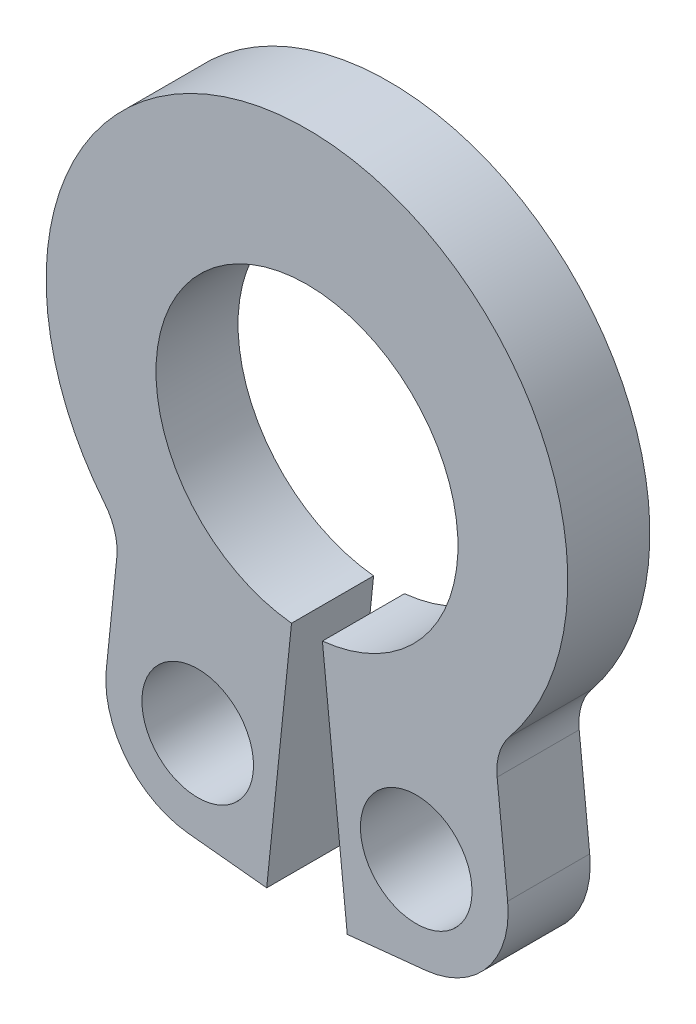
ISO-10303-21;
HEADER;
FILE_DESCRIPTION(('STEP AP214'),'2;1');
FILE_NAME('part.step','',(''),(''),'','','');
FILE_SCHEMA(('AUTOMOTIVE_DESIGN { 1 0 10303 214 1 1 1 1 }'));
ENDSEC;
DATA;
#1=APPLICATION_CONTEXT('core data for automotive mechanical design processes');
#2=APPLICATION_PROTOCOL_DEFINITION('international standard','automotive_design',2000,#1);
#3=PRODUCT_CONTEXT('',#1,'mechanical');
#4=PRODUCT('Part','Part','',(#3));
#5=PRODUCT_RELATED_PRODUCT_CATEGORY('part','',(#4));
#6=PRODUCT_DEFINITION_FORMATION('','',#4);
#7=PRODUCT_DEFINITION_CONTEXT('part definition',#1,'design');
#8=PRODUCT_DEFINITION('design','',#6,#7);
#9=PRODUCT_DEFINITION_SHAPE('','',#8);
#10=(LENGTH_UNIT() NAMED_UNIT(*) SI_UNIT(.MILLI.,.METRE.));
#11=(NAMED_UNIT(*) PLANE_ANGLE_UNIT() SI_UNIT($,.RADIAN.));
#12=(NAMED_UNIT(*) SI_UNIT($,.STERADIAN.) SOLID_ANGLE_UNIT());
#13=UNCERTAINTY_MEASURE_WITH_UNIT(LENGTH_MEASURE(1.E-05),#10,'distance_accuracy_value','');
#14=(GEOMETRIC_REPRESENTATION_CONTEXT(3) GLOBAL_UNCERTAINTY_ASSIGNED_CONTEXT((#13)) GLOBAL_UNIT_ASSIGNED_CONTEXT((#10,
#11,#12)) REPRESENTATION_CONTEXT('',''));
#15=CARTESIAN_POINT('',(0.,0.,0.));
#16=DIRECTION('',(0.,0.,1.));
#17=DIRECTION('',(1.,0.,0.));
#18=AXIS2_PLACEMENT_3D('',#15,#16,#17);
#19=CARTESIAN_POINT('',(0.,0.,-0.635));
#20=DIRECTION('',(0.,0.,1.));
#21=DIRECTION('',(1.,0.,0.));
#22=AXIS2_PLACEMENT_3D('',#19,#20,#21);
#23=CYLINDRICAL_SURFACE('',#22,1.1684);
#24=CARTESIAN_POINT('',(0.,0.,0.));
#25=DIRECTION('',(0.,0.,-1.));
#26=DIRECTION('',(1.,0.,0.));
#27=AXIS2_PLACEMENT_3D('',#24,#25,#26);
#28=CIRCLE('',#27,1.1684);
#29=CARTESIAN_POINT('',(-0.119485431623874,-1.1622744046178,0.));
#30=VERTEX_POINT('',#29);
#31=CARTESIAN_POINT('',(0.119485431623874,-1.1622744046178,0.));
#32=VERTEX_POINT('',#31);
#33=EDGE_CURVE('E153',#30,#32,#28,.T.);
#34=ORIENTED_EDGE('',*,*,#33,.F.);
#35=DIRECTION('',(0.,0.,1.));
#36=VECTOR('',#35,1.);
#37=CARTESIAN_POINT('',(-0.119485431623874,-1.1622744046178,-0.635));
#38=LINE('',#37,#36);
#39=CARTESIAN_POINT('',(-0.119485431623874,-1.1622744046178,-0.635));
#40=VERTEX_POINT('',#39);
#41=EDGE_CURVE('E11',#40,#30,#38,.T.);
#42=ORIENTED_EDGE('',*,*,#41,.F.);
#43=CARTESIAN_POINT('',(0.,0.,-0.635));
#44=DIRECTION('',(0.,0.,-1.));
#45=DIRECTION('',(1.,0.,0.));
#46=AXIS2_PLACEMENT_3D('',#43,#44,#45);
#47=CIRCLE('',#46,1.1684);
#48=CARTESIAN_POINT('',(0.119485431623874,-1.1622744046178,-0.635));
#49=VERTEX_POINT('',#48);
#50=EDGE_CURVE('E186',#40,#49,#47,.T.);
#51=ORIENTED_EDGE('',*,*,#50,.T.);
#52=DIRECTION('',(0.,0.,1.));
#53=VECTOR('',#52,1.);
#54=CARTESIAN_POINT('',(0.119485431623874,-1.1622744046178,-0.635));
#55=LINE('',#54,#53);
#56=EDGE_CURVE('E35',#49,#32,#55,.T.);
#57=ORIENTED_EDGE('',*,*,#56,.T.);
#58=EDGE_LOOP('',(#34,#42,#51,#57));
#59=FACE_BOUND('',#58,.T.);
#60=ADVANCED_FACE('F32',(#59),#23,.F.);
#61=CARTESIAN_POINT('',(-0.119485431623874,-1.1622744046178,-0.635));
#62=DIRECTION('',(0.994757278858095,-0.102264148942035,0.));
#63=DIRECTION('',(0.102264148942035,0.994757278858095,0.));
#64=AXIS2_PLACEMENT_3D('',#61,#62,#63);
#65=PLANE('',#64);
#66=DIRECTION('',(0.102264148942034,0.994757278858095,0.));
#67=VECTOR('',#66,1.);
#68=CARTESIAN_POINT('',(-0.119485431623874,-1.1622744046178,0.));
#69=LINE('',#68,#67);
#70=CARTESIAN_POINT('',(-0.311701125975322,-3.03202018595947,0.));
#71=VERTEX_POINT('',#70);
#72=EDGE_CURVE('E184',#71,#30,#69,.T.);
#73=ORIENTED_EDGE('',*,*,#72,.F.);
#74=DIRECTION('',(0.,0.,1.));
#75=VECTOR('',#74,1.);
#76=CARTESIAN_POINT('',(-0.311701125975322,-3.03202018595947,-0.635));
#77=LINE('',#76,#75);
#78=CARTESIAN_POINT('',(-0.311701125975322,-3.03202018595947,-0.635));
#79=VERTEX_POINT('',#78);
#80=EDGE_CURVE('E41',#79,#71,#77,.T.);
#81=ORIENTED_EDGE('',*,*,#80,.F.);
#82=DIRECTION('',(0.102264148942034,0.994757278858095,0.));
#83=VECTOR('',#82,1.);
#84=CARTESIAN_POINT('',(-0.119485431623874,-1.1622744046178,-0.635));
#85=LINE('',#84,#83);
#86=EDGE_CURVE('E143',#79,#40,#85,.T.);
#87=ORIENTED_EDGE('',*,*,#86,.T.);
#88=ORIENTED_EDGE('',*,*,#41,.T.);
#89=EDGE_LOOP('',(#73,#81,#87,#88));
#90=FACE_BOUND('',#89,.T.);
#91=ADVANCED_FACE('F206',(#90),#65,.T.);
#92=CARTESIAN_POINT('',(-0.311701125975322,-3.03202018595947,-0.635));
#93=DIRECTION('',(-0.102264148942033,-0.994757278858095,0.));
#94=DIRECTION('',(0.994757278858095,-0.102264148942033,0.));
#95=AXIS2_PLACEMENT_3D('',#92,#93,#94);
#96=PLANE('',#95);
#97=DIRECTION('',(0.994757278858095,-0.102264148942033,0.));
#98=VECTOR('',#97,1.);
#99=CARTESIAN_POINT('',(-0.311701125975322,-3.03202018595947,0.));
#100=LINE('',#99,#98);
#101=CARTESIAN_POINT('',(-0.918105163167215,-2.96967996076441,0.));
#102=VERTEX_POINT('',#101);
#103=EDGE_CURVE('E130',#102,#71,#100,.T.);
#104=ORIENTED_EDGE('',*,*,#103,.F.);
#105=DIRECTION('',(0.,0.,1.));
#106=VECTOR('',#105,1.);
#107=CARTESIAN_POINT('',(-0.918105163167215,-2.96967996076441,-0.635));
#108=LINE('',#107,#106);
#109=CARTESIAN_POINT('',(-0.918105163167215,-2.96967996076441,-0.635));
#110=VERTEX_POINT('',#109);
#111=EDGE_CURVE('E125',#110,#102,#108,.T.);
#112=ORIENTED_EDGE('',*,*,#111,.F.);
#113=DIRECTION('',(0.994757278858095,-0.102264148942033,0.));
#114=VECTOR('',#113,1.);
#115=CARTESIAN_POINT('',(-0.311701125975322,-3.03202018595947,-0.635));
#116=LINE('',#115,#114);
#117=EDGE_CURVE('E128',#110,#79,#116,.T.);
#118=ORIENTED_EDGE('',*,*,#117,.T.);
#119=ORIENTED_EDGE('',*,*,#80,.T.);
#120=EDGE_LOOP('',(#104,#112,#118,#119));
#121=FACE_BOUND('',#120,.T.);
#122=ADVANCED_FACE('F127',(#121),#96,.T.);
#123=CARTESIAN_POINT('',(-0.84537490043964,-2.26220858404053,-0.635));
#124=DIRECTION('',(0.,0.,1.));
#125=DIRECTION('',(1.,0.,0.));
#126=AXIS2_PLACEMENT_3D('',#123,#124,#125);
#127=CYLINDRICAL_SURFACE('',#126,0.7112);
#128=CARTESIAN_POINT('',(-0.84537490043964,-2.26220858404053,0.));
#129=DIRECTION('',(0.,0.,1.));
#130=DIRECTION('',(1.,0.,0.));
#131=AXIS2_PLACEMENT_3D('',#128,#129,#130);
#132=CIRCLE('',#131,0.7112);
#133=CARTESIAN_POINT('',(-1.55284627716352,-2.18947832131296,0.));
#134=VERTEX_POINT('',#133);
#135=EDGE_CURVE('E181',#134,#102,#132,.T.);
#136=ORIENTED_EDGE('',*,*,#135,.F.);
#137=DIRECTION('',(0.,0.,1.));
#138=VECTOR('',#137,1.);
#139=CARTESIAN_POINT('',(-1.55284627716352,-2.18947832131296,-0.635));
#140=LINE('',#139,#138);
#141=CARTESIAN_POINT('',(-1.55284627716352,-2.18947832131296,-0.635));
#142=VERTEX_POINT('',#141);
#143=EDGE_CURVE('E135',#142,#134,#140,.T.);
#144=ORIENTED_EDGE('',*,*,#143,.F.);
#145=CARTESIAN_POINT('',(-0.84537490043964,-2.26220858404053,-0.635));
#146=DIRECTION('',(0.,0.,1.));
#147=DIRECTION('',(1.,0.,0.));
#148=AXIS2_PLACEMENT_3D('',#145,#146,#147);
#149=CIRCLE('',#148,0.7112);
#150=EDGE_CURVE('E141',#142,#110,#149,.T.);
#151=ORIENTED_EDGE('',*,*,#150,.T.);
#152=ORIENTED_EDGE('',*,*,#111,.T.);
#153=EDGE_LOOP('',(#136,#144,#151,#152));
#154=FACE_BOUND('',#153,.T.);
#155=ADVANCED_FACE('F145',(#154),#127,.T.);
#156=CARTESIAN_POINT('',(-1.47150915695553,-1.39828518857481,-0.635));
#157=DIRECTION('',(-0.994757278858095,0.102264148942035,0.));
#158=DIRECTION('',(-0.102264148942035,-0.994757278858095,0.));
#159=AXIS2_PLACEMENT_3D('',#156,#157,#158);
#160=PLANE('',#159);
#161=DIRECTION('',(-0.102264148942035,-0.994757278858095,0.));
#162=VECTOR('',#161,1.);
#163=CARTESIAN_POINT('',(-1.47150915695553,-1.39828518857481,0.));
#164=LINE('',#163,#162);
#165=CARTESIAN_POINT('',(-1.47150915695553,-1.39828518857481,0.));
#166=VERTEX_POINT('',#165);
#167=EDGE_CURVE('E178',#166,#134,#164,.T.);
#168=ORIENTED_EDGE('',*,*,#167,.F.);
#169=DIRECTION('',(0.,0.,1.));
#170=VECTOR('',#169,1.);
#171=CARTESIAN_POINT('',(-1.47150915695553,-1.39828518857481,-0.635));
#172=LINE('',#171,#170);
#173=CARTESIAN_POINT('',(-1.47150915695553,-1.39828518857481,-0.635));
#174=VERTEX_POINT('',#173);
#175=EDGE_CURVE('E190',#174,#166,#172,.T.);
#176=ORIENTED_EDGE('',*,*,#175,.F.);
#177=DIRECTION('',(-0.102264148942035,-0.994757278858095,0.));
#178=VECTOR('',#177,1.);
#179=CARTESIAN_POINT('',(-1.47150915695553,-1.39828518857481,-0.635));
#180=LINE('',#179,#178);
#181=EDGE_CURVE('E146',#174,#142,#180,.T.);
#182=ORIENTED_EDGE('',*,*,#181,.T.);
#183=ORIENTED_EDGE('',*,*,#143,.T.);
#184=EDGE_LOOP('',(#168,#176,#182,#183));
#185=FACE_BOUND('',#184,.T.);
#186=ADVANCED_FACE('F219',(#185),#160,.T.);
#187=CARTESIAN_POINT('',(-1.90104534996646,-1.35412752906163,-0.635));
#188=DIRECTION('',(0.,0.,1.));
#189=DIRECTION('',(1.,0.,0.));
#190=AXIS2_PLACEMENT_3D('',#187,#188,#189);
#191=CYLINDRICAL_SURFACE('',#190,0.4318);
#192=CARTESIAN_POINT('',(-1.90104534996646,-1.35412752906163,0.));
#193=DIRECTION('',(0.,0.,-1.));
#194=DIRECTION('',(1.,0.,0.));
#195=AXIS2_PLACEMENT_3D('',#192,#193,#194);
#196=CIRCLE('',#195,0.4318);
#197=CARTESIAN_POINT('',(-1.56600858918855,-1.08172780636088,0.));
#198=VERTEX_POINT('',#197);
#199=EDGE_CURVE('E175',#198,#166,#196,.T.);
#200=ORIENTED_EDGE('',*,*,#199,.F.);
#201=DIRECTION('',(0.,0.,1.));
#202=VECTOR('',#201,1.);
#203=CARTESIAN_POINT('',(-1.56600858918855,-1.08172780636088,-0.635));
#204=LINE('',#203,#202);
#205=CARTESIAN_POINT('',(-1.56600858918855,-1.08172780636088,-0.635));
#206=VERTEX_POINT('',#205);
#207=EDGE_CURVE('E192',#206,#198,#204,.T.);
#208=ORIENTED_EDGE('',*,*,#207,.F.);
#209=CARTESIAN_POINT('',(-1.90104534996646,-1.35412752906163,-0.635));
#210=DIRECTION('',(0.,0.,-1.));
#211=DIRECTION('',(1.,0.,0.));
#212=AXIS2_PLACEMENT_3D('',#209,#210,#211);
#213=CIRCLE('',#212,0.4318);
#214=EDGE_CURVE('E148',#206,#174,#213,.T.);
#215=ORIENTED_EDGE('',*,*,#214,.T.);
#216=ORIENTED_EDGE('',*,*,#175,.T.);
#217=EDGE_LOOP('',(#200,#208,#215,#216));
#218=FACE_BOUND('',#217,.T.);
#219=ADVANCED_FACE('F222',(#218),#191,.F.);
#220=CARTESIAN_POINT('',(0.,0.191506523064618,-0.635));
#221=DIRECTION('',(0.,0.,1.));
#222=DIRECTION('',(1.,0.,0.));
#223=AXIS2_PLACEMENT_3D('',#220,#221,#222);
#224=CYLINDRICAL_SURFACE('',#223,2.01829347693538);
#225=CARTESIAN_POINT('',(0.,0.191506523064618,0.));
#226=DIRECTION('',(0.,0.,1.));
#227=DIRECTION('',(1.,0.,0.));
#228=AXIS2_PLACEMENT_3D('',#225,#226,#227);
#229=CIRCLE('',#228,2.01829347693538);
#230=CARTESIAN_POINT('',(1.56600858918855,-1.08172780636088,0.));
#231=VERTEX_POINT('',#230);
#232=EDGE_CURVE('E172',#231,#198,#229,.T.);
#233=ORIENTED_EDGE('',*,*,#232,.F.);
#234=DIRECTION('',(0.,0.,1.));
#235=VECTOR('',#234,1.);
#236=CARTESIAN_POINT('',(1.56600858918855,-1.08172780636088,-0.635));
#237=LINE('',#236,#235);
#238=CARTESIAN_POINT('',(1.56600858918855,-1.08172780636088,-0.635));
#239=VERTEX_POINT('',#238);
#240=EDGE_CURVE('E194',#239,#231,#237,.T.);
#241=ORIENTED_EDGE('',*,*,#240,.F.);
#242=CARTESIAN_POINT('',(0.,0.191506523064618,-0.635));
#243=DIRECTION('',(0.,0.,1.));
#244=DIRECTION('',(1.,0.,0.));
#245=AXIS2_PLACEMENT_3D('',#242,#243,#244);
#246=CIRCLE('',#245,2.01829347693538);
#247=EDGE_CURVE('E296',#239,#206,#246,.T.);
#248=ORIENTED_EDGE('',*,*,#247,.T.);
#249=ORIENTED_EDGE('',*,*,#207,.T.);
#250=EDGE_LOOP('',(#233,#241,#248,#249));
#251=FACE_BOUND('',#250,.T.);
#252=ADVANCED_FACE('F226',(#251),#224,.T.);
#253=CARTESIAN_POINT('',(1.90104534996646,-1.35412752906163,-0.635));
#254=DIRECTION('',(0.,0.,1.));
#255=DIRECTION('',(1.,0.,0.));
#256=AXIS2_PLACEMENT_3D('',#253,#254,#255);
#257=CYLINDRICAL_SURFACE('',#256,0.4318);
#258=CARTESIAN_POINT('',(1.90104534996646,-1.35412752906163,0.));
#259=DIRECTION('',(0.,0.,-1.));
#260=DIRECTION('',(1.,0.,0.));
#261=AXIS2_PLACEMENT_3D('',#258,#259,#260);
#262=CIRCLE('',#261,0.4318);
#263=CARTESIAN_POINT('',(1.47150915695553,-1.39828518857481,0.));
#264=VERTEX_POINT('',#263);
#265=EDGE_CURVE('E169',#264,#231,#262,.T.);
#266=ORIENTED_EDGE('',*,*,#265,.F.);
#267=DIRECTION('',(0.,0.,1.));
#268=VECTOR('',#267,1.);
#269=CARTESIAN_POINT('',(1.47150915695553,-1.39828518857481,-0.635));
#270=LINE('',#269,#268);
#271=CARTESIAN_POINT('',(1.47150915695553,-1.39828518857481,-0.635));
#272=VERTEX_POINT('',#271);
#273=EDGE_CURVE('E196',#272,#264,#270,.T.);
#274=ORIENTED_EDGE('',*,*,#273,.F.);
#275=CARTESIAN_POINT('',(1.90104534996646,-1.35412752906163,-0.635));
#276=DIRECTION('',(0.,0.,-1.));
#277=DIRECTION('',(1.,0.,0.));
#278=AXIS2_PLACEMENT_3D('',#275,#276,#277);
#279=CIRCLE('',#278,0.4318);
#280=EDGE_CURVE('E293',#272,#239,#279,.T.);
#281=ORIENTED_EDGE('',*,*,#280,.T.);
#282=ORIENTED_EDGE('',*,*,#240,.T.);
#283=EDGE_LOOP('',(#266,#274,#281,#282));
#284=FACE_BOUND('',#283,.T.);
#285=ADVANCED_FACE('F230',(#284),#257,.F.);
#286=CARTESIAN_POINT('',(1.47150915695553,-1.39828518857481,-0.635));
#287=DIRECTION('',(0.994757278858095,0.102264148942035,0.));
#288=DIRECTION('',(-0.102264148942035,0.994757278858095,0.));
#289=AXIS2_PLACEMENT_3D('',#286,#287,#288);
#290=PLANE('',#289);
#291=DIRECTION('',(-0.102264148942035,0.994757278858095,0.));
#292=VECTOR('',#291,1.);
#293=CARTESIAN_POINT('',(1.47150915695553,-1.39828518857481,0.));
#294=LINE('',#293,#292);
#295=CARTESIAN_POINT('',(1.55284627716352,-2.18947832131296,0.));
#296=VERTEX_POINT('',#295);
#297=EDGE_CURVE('E166',#296,#264,#294,.T.);
#298=ORIENTED_EDGE('',*,*,#297,.F.);
#299=DIRECTION('',(0.,0.,1.));
#300=VECTOR('',#299,1.);
#301=CARTESIAN_POINT('',(1.55284627716352,-2.18947832131296,-0.635));
#302=LINE('',#301,#300);
#303=CARTESIAN_POINT('',(1.55284627716352,-2.18947832131296,-0.635));
#304=VERTEX_POINT('',#303);
#305=EDGE_CURVE('E198',#304,#296,#302,.T.);
#306=ORIENTED_EDGE('',*,*,#305,.F.);
#307=DIRECTION('',(-0.102264148942035,0.994757278858095,0.));
#308=VECTOR('',#307,1.);
#309=CARTESIAN_POINT('',(1.47150915695553,-1.39828518857481,-0.635));
#310=LINE('',#309,#308);
#311=EDGE_CURVE('E290',#304,#272,#310,.T.);
#312=ORIENTED_EDGE('',*,*,#311,.T.);
#313=ORIENTED_EDGE('',*,*,#273,.T.);
#314=EDGE_LOOP('',(#298,#306,#312,#313));
#315=FACE_BOUND('',#314,.T.);
#316=ADVANCED_FACE('F234',(#315),#290,.T.);
#317=CARTESIAN_POINT('',(0.84537490043964,-2.26220858404053,-0.635));
#318=DIRECTION('',(0.,0.,1.));
#319=DIRECTION('',(1.,0.,0.));
#320=AXIS2_PLACEMENT_3D('',#317,#318,#319);
#321=CYLINDRICAL_SURFACE('',#320,0.7112);
#322=CARTESIAN_POINT('',(0.84537490043964,-2.26220858404053,0.));
#323=DIRECTION('',(0.,0.,1.));
#324=DIRECTION('',(1.,0.,0.));
#325=AXIS2_PLACEMENT_3D('',#322,#323,#324);
#326=CIRCLE('',#325,0.7112);
#327=CARTESIAN_POINT('',(0.918105163167215,-2.96967996076441,0.));
#328=VERTEX_POINT('',#327);
#329=EDGE_CURVE('E163',#328,#296,#326,.T.);
#330=ORIENTED_EDGE('',*,*,#329,.F.);
#331=DIRECTION('',(0.,0.,1.));
#332=VECTOR('',#331,1.);
#333=CARTESIAN_POINT('',(0.918105163167215,-2.96967996076441,-0.635));
#334=LINE('',#333,#332);
#335=CARTESIAN_POINT('',(0.918105163167215,-2.96967996076441,-0.635));
#336=VERTEX_POINT('',#335);
#337=EDGE_CURVE('E200',#336,#328,#334,.T.);
#338=ORIENTED_EDGE('',*,*,#337,.F.);
#339=CARTESIAN_POINT('',(0.84537490043964,-2.26220858404053,-0.635));
#340=DIRECTION('',(0.,0.,1.));
#341=DIRECTION('',(1.,0.,0.));
#342=AXIS2_PLACEMENT_3D('',#339,#340,#341);
#343=CIRCLE('',#342,0.7112);
#344=EDGE_CURVE('E287',#336,#304,#343,.T.);
#345=ORIENTED_EDGE('',*,*,#344,.T.);
#346=ORIENTED_EDGE('',*,*,#305,.T.);
#347=EDGE_LOOP('',(#330,#338,#345,#346));
#348=FACE_BOUND('',#347,.T.);
#349=ADVANCED_FACE('F238',(#348),#321,.T.);
#350=CARTESIAN_POINT('',(0.311701125975322,-3.03202018595947,-0.635));
#351=DIRECTION('',(0.102264148942033,-0.994757278858095,0.));
#352=DIRECTION('',(0.994757278858095,0.102264148942033,0.));
#353=AXIS2_PLACEMENT_3D('',#350,#351,#352);
#354=PLANE('',#353);
#355=DIRECTION('',(0.994757278858095,0.102264148942033,0.));
#356=VECTOR('',#355,1.);
#357=CARTESIAN_POINT('',(0.311701125975322,-3.03202018595947,0.));
#358=LINE('',#357,#356);
#359=CARTESIAN_POINT('',(0.311701125975322,-3.03202018595947,0.));
#360=VERTEX_POINT('',#359);
#361=EDGE_CURVE('E160',#360,#328,#358,.T.);
#362=ORIENTED_EDGE('',*,*,#361,.F.);
#363=DIRECTION('',(0.,0.,1.));
#364=VECTOR('',#363,1.);
#365=CARTESIAN_POINT('',(0.311701125975322,-3.03202018595947,-0.635));
#366=LINE('',#365,#364);
#367=CARTESIAN_POINT('',(0.311701125975322,-3.03202018595947,-0.635));
#368=VERTEX_POINT('',#367);
#369=EDGE_CURVE('E201',#368,#360,#366,.T.);
#370=ORIENTED_EDGE('',*,*,#369,.F.);
#371=DIRECTION('',(0.994757278858095,0.102264148942033,0.));
#372=VECTOR('',#371,1.);
#373=CARTESIAN_POINT('',(0.311701125975322,-3.03202018595947,-0.635));
#374=LINE('',#373,#372);
#375=EDGE_CURVE('E284',#368,#336,#374,.T.);
#376=ORIENTED_EDGE('',*,*,#375,.T.);
#377=ORIENTED_EDGE('',*,*,#337,.T.);
#378=EDGE_LOOP('',(#362,#370,#376,#377));
#379=FACE_BOUND('',#378,.T.);
#380=ADVANCED_FACE('F242',(#379),#354,.T.);
#381=CARTESIAN_POINT('',(0.119485431623874,-1.1622744046178,-0.635));
#382=DIRECTION('',(-0.994757278858095,-0.102264148942035,0.));
#383=DIRECTION('',(0.102264148942035,-0.994757278858095,0.));
#384=AXIS2_PLACEMENT_3D('',#381,#382,#383);
#385=PLANE('',#384);
#386=DIRECTION('',(0.102264148942034,-0.994757278858095,0.));
#387=VECTOR('',#386,1.);
#388=CARTESIAN_POINT('',(0.119485431623874,-1.1622744046178,0.));
#389=LINE('',#388,#387);
#390=EDGE_CURVE('E156',#32,#360,#389,.T.);
#391=ORIENTED_EDGE('',*,*,#390,.F.);
#392=ORIENTED_EDGE('',*,*,#56,.F.);
#393=DIRECTION('',(0.102264148942034,-0.994757278858095,0.));
#394=VECTOR('',#393,1.);
#395=CARTESIAN_POINT('',(0.119485431623874,-1.1622744046178,-0.635));
#396=LINE('',#395,#394);
#397=EDGE_CURVE('E282',#49,#368,#396,.T.);
#398=ORIENTED_EDGE('',*,*,#397,.T.);
#399=ORIENTED_EDGE('',*,*,#369,.T.);
#400=EDGE_LOOP('',(#391,#392,#398,#399));
#401=FACE_BOUND('',#400,.T.);
#402=ADVANCED_FACE('F203',(#401),#385,.T.);
#403=CARTESIAN_POINT('',(0.,0.,-0.635));
#404=DIRECTION('',(0.,0.,1.));
#405=DIRECTION('',(1.,0.,0.));
#406=AXIS2_PLACEMENT_3D('',#403,#404,#405);
#407=PLANE('',#406);
#408=CARTESIAN_POINT('',(-0.845374900439641,-2.26220858404053,-0.635));
#409=DIRECTION('',(0.,0.,1.));
#410=DIRECTION('',(1.,0.,0.));
#411=AXIS2_PLACEMENT_3D('',#408,#409,#410);
#412=CIRCLE('',#411,0.4318);
#413=CARTESIAN_POINT('',(-0.413574900439641,-2.26220858404053,-0.635));
#414=VERTEX_POINT('',#413);
#415=EDGE_CURVE('E269',#414,#414,#412,.T.);
#416=ORIENTED_EDGE('',*,*,#415,.T.);
#417=EDGE_LOOP('',(#416));
#418=FACE_BOUND('',#417,.T.);
#419=CARTESIAN_POINT('',(0.845374900439642,-2.26220858404053,-0.635));
#420=DIRECTION('',(0.,0.,1.));
#421=DIRECTION('',(1.,0.,0.));
#422=AXIS2_PLACEMENT_3D('',#419,#420,#421);
#423=CIRCLE('',#422,0.4318);
#424=CARTESIAN_POINT('',(1.27717490043964,-2.26220858404053,-0.635));
#425=VERTEX_POINT('',#424);
#426=EDGE_CURVE('E157',#425,#425,#423,.T.);
#427=ORIENTED_EDGE('',*,*,#426,.T.);
#428=EDGE_LOOP('',(#427));
#429=FACE_BOUND('',#428,.T.);
#430=ORIENTED_EDGE('',*,*,#50,.F.);
#431=ORIENTED_EDGE('',*,*,#86,.F.);
#432=ORIENTED_EDGE('',*,*,#117,.F.);
#433=ORIENTED_EDGE('',*,*,#150,.F.);
#434=ORIENTED_EDGE('',*,*,#181,.F.);
#435=ORIENTED_EDGE('',*,*,#214,.F.);
#436=ORIENTED_EDGE('',*,*,#247,.F.);
#437=ORIENTED_EDGE('',*,*,#280,.F.);
#438=ORIENTED_EDGE('',*,*,#311,.F.);
#439=ORIENTED_EDGE('',*,*,#344,.F.);
#440=ORIENTED_EDGE('',*,*,#375,.F.);
#441=ORIENTED_EDGE('',*,*,#397,.F.);
#442=EDGE_LOOP('',(#430,#431,#432,#433,#434,#435,#436,#437,#438,#439,#440,#441));
#443=FACE_BOUND('',#442,.T.);
#444=ADVANCED_FACE('F139',(#418,#429,#443),#407,.F.);
#445=CARTESIAN_POINT('',(0.,0.,0.));
#446=DIRECTION('',(0.,0.,1.));
#447=DIRECTION('',(1.,0.,0.));
#448=AXIS2_PLACEMENT_3D('',#445,#446,#447);
#449=PLANE('',#448);
#450=CARTESIAN_POINT('',(-0.845374900439641,-2.26220858404053,0.));
#451=DIRECTION('',(0.,0.,1.));
#452=DIRECTION('',(1.,0.,0.));
#453=AXIS2_PLACEMENT_3D('',#450,#451,#452);
#454=CIRCLE('',#453,0.4318);
#455=CARTESIAN_POINT('',(-0.413574900439641,-2.26220858404053,0.));
#456=VERTEX_POINT('',#455);
#457=EDGE_CURVE('E272',#456,#456,#454,.T.);
#458=ORIENTED_EDGE('',*,*,#457,.F.);
#459=EDGE_LOOP('',(#458));
#460=FACE_BOUND('',#459,.T.);
#461=CARTESIAN_POINT('',(0.845374900439642,-2.26220858404053,0.));
#462=DIRECTION('',(0.,0.,1.));
#463=DIRECTION('',(1.,0.,0.));
#464=AXIS2_PLACEMENT_3D('',#461,#462,#463);
#465=CIRCLE('',#464,0.4318);
#466=CARTESIAN_POINT('',(1.27717490043964,-2.26220858404053,0.));
#467=VERTEX_POINT('',#466);
#468=EDGE_CURVE('E274',#467,#467,#465,.T.);
#469=ORIENTED_EDGE('',*,*,#468,.F.);
#470=EDGE_LOOP('',(#469));
#471=FACE_BOUND('',#470,.T.);
#472=ORIENTED_EDGE('',*,*,#33,.T.);
#473=ORIENTED_EDGE('',*,*,#390,.T.);
#474=ORIENTED_EDGE('',*,*,#361,.T.);
#475=ORIENTED_EDGE('',*,*,#329,.T.);
#476=ORIENTED_EDGE('',*,*,#297,.T.);
#477=ORIENTED_EDGE('',*,*,#265,.T.);
#478=ORIENTED_EDGE('',*,*,#232,.T.);
#479=ORIENTED_EDGE('',*,*,#199,.T.);
#480=ORIENTED_EDGE('',*,*,#167,.T.);
#481=ORIENTED_EDGE('',*,*,#135,.T.);
#482=ORIENTED_EDGE('',*,*,#103,.T.);
#483=ORIENTED_EDGE('',*,*,#72,.T.);
#484=EDGE_LOOP('',(#472,#473,#474,#475,#476,#477,#478,#479,#480,#481,#482,#483));
#485=FACE_BOUND('',#484,.T.);
#486=ADVANCED_FACE('F205',(#460,#471,#485),#449,.T.);
#487=CARTESIAN_POINT('',(0.845374900439642,-2.26220858404053,-0.635));
#488=DIRECTION('',(0.,0.,1.));
#489=DIRECTION('',(1.,0.,0.));
#490=AXIS2_PLACEMENT_3D('',#487,#488,#489);
#491=CYLINDRICAL_SURFACE('',#490,0.4318);
#492=ORIENTED_EDGE('',*,*,#426,.F.);
#493=EDGE_LOOP('',(#492));
#494=FACE_BOUND('',#493,.T.);
#495=ORIENTED_EDGE('',*,*,#468,.T.);
#496=EDGE_LOOP('',(#495));
#497=FACE_BOUND('',#496,.T.);
#498=ADVANCED_FACE('F254',(#494,#497),#491,.F.);
#499=CARTESIAN_POINT('',(-0.845374900439641,-2.26220858404053,-0.635));
#500=DIRECTION('',(0.,0.,1.));
#501=DIRECTION('',(1.,0.,0.));
#502=AXIS2_PLACEMENT_3D('',#499,#500,#501);
#503=CYLINDRICAL_SURFACE('',#502,0.4318);
#504=ORIENTED_EDGE('',*,*,#415,.F.);
#505=EDGE_LOOP('',(#504));
#506=FACE_BOUND('',#505,.T.);
#507=ORIENTED_EDGE('',*,*,#457,.T.);
#508=EDGE_LOOP('',(#507));
#509=FACE_BOUND('',#508,.T.);
#510=ADVANCED_FACE('F261',(#506,#509),#503,.F.);
#511=CLOSED_SHELL('',(#60,#91,#122,#155,#186,#219,#252,#285,#316,#349,#380,#402,#444,#486,#498,#510));
#512=MANIFOLD_SOLID_BREP('B2',#511);
#513=ADVANCED_BREP_SHAPE_REPRESENTATION('',(#18,#512),#14);
#514=SHAPE_DEFINITION_REPRESENTATION(#9,#513);
ENDSEC;
END-ISO-10303-21;
